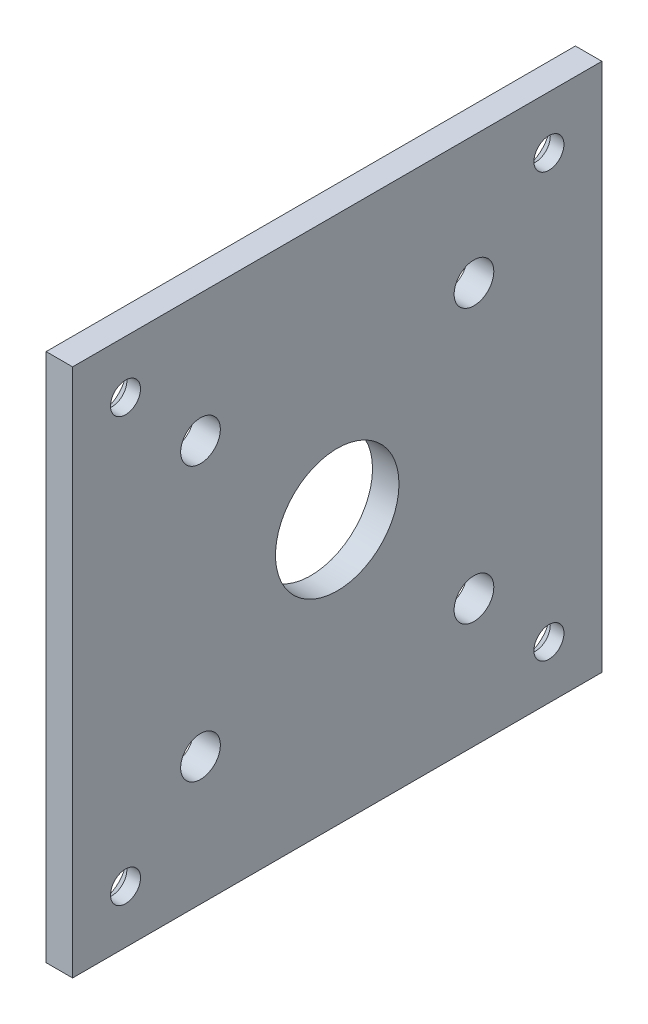
ISO-10303-21;
HEADER;
FILE_DESCRIPTION(('STEP AP214'),'2;1');
FILE_NAME('part.step','',(''),(''),'','','');
FILE_SCHEMA(('AUTOMOTIVE_DESIGN { 1 0 10303 214 1 1 1 1 }'));
ENDSEC;
DATA;
#1=APPLICATION_CONTEXT('core data for automotive mechanical design processes');
#2=APPLICATION_PROTOCOL_DEFINITION('international standard','automotive_design',2000,#1);
#3=PRODUCT_CONTEXT('',#1,'mechanical');
#4=PRODUCT('Part','Part','',(#3));
#5=PRODUCT_RELATED_PRODUCT_CATEGORY('part','',(#4));
#6=PRODUCT_DEFINITION_FORMATION('','',#4);
#7=PRODUCT_DEFINITION_CONTEXT('part definition',#1,'design');
#8=PRODUCT_DEFINITION('design','',#6,#7);
#9=PRODUCT_DEFINITION_SHAPE('','',#8);
#10=(LENGTH_UNIT() NAMED_UNIT(*) SI_UNIT(.MILLI.,.METRE.));
#11=(NAMED_UNIT(*) PLANE_ANGLE_UNIT() SI_UNIT($,.RADIAN.));
#12=(NAMED_UNIT(*) SI_UNIT($,.STERADIAN.) SOLID_ANGLE_UNIT());
#13=UNCERTAINTY_MEASURE_WITH_UNIT(LENGTH_MEASURE(1.E-05),#10,'distance_accuracy_value','');
#14=(GEOMETRIC_REPRESENTATION_CONTEXT(3) GLOBAL_UNCERTAINTY_ASSIGNED_CONTEXT((#13)) GLOBAL_UNIT_ASSIGNED_CONTEXT((#10,
#11,#12)) REPRESENTATION_CONTEXT('',''));
#15=CARTESIAN_POINT('',(0.,0.,0.));
#16=DIRECTION('',(0.,0.,1.));
#17=DIRECTION('',(1.,0.,0.));
#18=AXIS2_PLACEMENT_3D('',#15,#16,#17);
#19=CARTESIAN_POINT('',(0.0193000000194843,6.,6.000049774017));
#20=DIRECTION('',(-1.,0.,0.));
#21=DIRECTION('',(0.,0.,1.));
#22=AXIS2_PLACEMENT_3D('',#19,#20,#21);
#23=CONICAL_SURFACE('',#22,3.15000000003374,0.785398163397448);
#24=CARTESIAN_POINT('',(0.0192999999912898,6.,6.000049774017));
#25=DIRECTION('',(-1.,0.,0.));
#26=DIRECTION('',(0.,0.,1.));
#27=AXIS2_PLACEMENT_3D('',#24,#25,#26);
#28=CIRCLE('',#27,3.15000000006194);
#29=CARTESIAN_POINT('',(0.0192999999912898,6.,9.15004977407894));
#30=VERTEX_POINT('',#29);
#31=EDGE_CURVE('E19',#30,#30,#28,.T.);
#32=ORIENTED_EDGE('',*,*,#31,.T.);
#33=EDGE_LOOP('',(#32));
#34=FACE_BOUND('',#33,.T.);
#35=CARTESIAN_POINT('',(1.4693,6.,6.000049774017));
#36=DIRECTION('',(1.,0.,0.));
#37=DIRECTION('',(0.,0.,-1.));
#38=AXIS2_PLACEMENT_3D('',#35,#36,#37);
#39=CIRCLE('',#38,1.7);
#40=CARTESIAN_POINT('',(1.4693,6.,4.300049774017));
#41=VERTEX_POINT('',#40);
#42=EDGE_CURVE('E125',#41,#41,#39,.T.);
#43=ORIENTED_EDGE('',*,*,#42,.T.);
#44=EDGE_LOOP('',(#43));
#45=FACE_BOUND('',#44,.T.);
#46=ADVANCED_FACE('F16',(#34,#45),#23,.F.);
#47=CARTESIAN_POINT('',(0.0192999999626409,54.,6.000049774017));
#48=DIRECTION('',(-1.,0.,0.));
#49=DIRECTION('',(0.,0.,1.));
#50=AXIS2_PLACEMENT_3D('',#47,#48,#49);
#51=CONICAL_SURFACE('',#50,3.14999999997872,0.785398163397448);
#52=CARTESIAN_POINT('',(0.0192999999362661,54.,6.000049774017));
#53=DIRECTION('',(-1.,0.,0.));
#54=DIRECTION('',(0.,0.,1.));
#55=AXIS2_PLACEMENT_3D('',#52,#53,#54);
#56=CIRCLE('',#55,3.15000000000509);
#57=CARTESIAN_POINT('',(0.0192999999362661,54.,9.15004977402209));
#58=VERTEX_POINT('',#57);
#59=EDGE_CURVE('E130',#58,#58,#56,.T.);
#60=ORIENTED_EDGE('',*,*,#59,.T.);
#61=EDGE_LOOP('',(#60));
#62=FACE_BOUND('',#61,.T.);
#63=CARTESIAN_POINT('',(1.4693,54.,6.000049774017));
#64=DIRECTION('',(1.,0.,0.));
#65=DIRECTION('',(0.,0.,-1.));
#66=AXIS2_PLACEMENT_3D('',#63,#64,#65);
#67=CIRCLE('',#66,1.7);
#68=CARTESIAN_POINT('',(1.4693,54.,4.300049774017));
#69=VERTEX_POINT('',#68);
#70=EDGE_CURVE('E121',#69,#69,#67,.T.);
#71=ORIENTED_EDGE('',*,*,#70,.T.);
#72=EDGE_LOOP('',(#71));
#73=FACE_BOUND('',#72,.T.);
#74=ADVANCED_FACE('F151',(#62,#73),#51,.F.);
#75=CARTESIAN_POINT('',(0.0193000000194843,6.,54.000049774017));
#76=DIRECTION('',(-1.,0.,0.));
#77=DIRECTION('',(0.,0.,1.));
#78=AXIS2_PLACEMENT_3D('',#75,#76,#77);
#79=CONICAL_SURFACE('',#78,3.15000000003374,0.785398163397448);
#80=CARTESIAN_POINT('',(0.0192999999912898,6.,54.000049774017));
#81=DIRECTION('',(-1.,0.,0.));
#82=DIRECTION('',(0.,0.,1.));
#83=AXIS2_PLACEMENT_3D('',#80,#81,#82);
#84=CIRCLE('',#83,3.15000000006194);
#85=CARTESIAN_POINT('',(0.0192999999912898,6.,57.1500497740789));
#86=VERTEX_POINT('',#85);
#87=EDGE_CURVE('E128',#86,#86,#84,.T.);
#88=ORIENTED_EDGE('',*,*,#87,.T.);
#89=EDGE_LOOP('',(#88));
#90=FACE_BOUND('',#89,.T.);
#91=CARTESIAN_POINT('',(1.4693,6.,54.000049774017));
#92=DIRECTION('',(1.,0.,0.));
#93=DIRECTION('',(0.,0.,-1.));
#94=AXIS2_PLACEMENT_3D('',#91,#92,#93);
#95=CIRCLE('',#94,1.7);
#96=CARTESIAN_POINT('',(1.4693,6.,52.300049774017));
#97=VERTEX_POINT('',#96);
#98=EDGE_CURVE('E111',#97,#97,#95,.T.);
#99=ORIENTED_EDGE('',*,*,#98,.T.);
#100=EDGE_LOOP('',(#99));
#101=FACE_BOUND('',#100,.T.);
#102=ADVANCED_FACE('F141',(#90,#101),#79,.F.);
#103=CARTESIAN_POINT('',(0.01929999999999,0.,4.977401658834E-05));
#104=DIRECTION('',(1.,0.,0.));
#105=DIRECTION('',(0.,0.,-1.));
#106=AXIS2_PLACEMENT_3D('',#103,#104,#105);
#107=PLANE('',#106);
#108=CARTESIAN_POINT('',(0.0192999999362661,54.,54.000049774017));
#109=DIRECTION('',(-1.,0.,0.));
#110=DIRECTION('',(0.,0.,1.));
#111=AXIS2_PLACEMENT_3D('',#108,#109,#110);
#112=CIRCLE('',#111,3.15000000000509);
#113=CARTESIAN_POINT('',(0.0192999999362661,54.,57.1500497740221));
#114=VERTEX_POINT('',#113);
#115=EDGE_CURVE('E72',#114,#114,#112,.F.);
#116=ORIENTED_EDGE('',*,*,#115,.T.);
#117=EDGE_LOOP('',(#116));
#118=FACE_BOUND('',#117,.T.);
#119=CARTESIAN_POINT('',(0.01929999999999,45.5,45.500049774017));
#120=DIRECTION('',(1.,0.,0.));
#121=DIRECTION('',(0.,0.,-1.));
#122=AXIS2_PLACEMENT_3D('',#119,#120,#121);
#123=CIRCLE('',#122,2.25);
#124=CARTESIAN_POINT('',(0.01929999999999,45.5,43.250049774017));
#125=VERTEX_POINT('',#124);
#126=EDGE_CURVE('E107',#125,#125,#123,.T.);
#127=ORIENTED_EDGE('',*,*,#126,.T.);
#128=EDGE_LOOP('',(#127));
#129=FACE_BOUND('',#128,.T.);
#130=CARTESIAN_POINT('',(0.01929999999999,30.,30.000049774017));
#131=DIRECTION('',(1.,0.,0.));
#132=DIRECTION('',(0.,0.,-1.));
#133=AXIS2_PLACEMENT_3D('',#130,#131,#132);
#134=CIRCLE('',#133,7.);
#135=CARTESIAN_POINT('',(0.01929999999999,30.,23.000049774017));
#136=VERTEX_POINT('',#135);
#137=EDGE_CURVE('E115',#136,#136,#134,.T.);
#138=ORIENTED_EDGE('',*,*,#137,.T.);
#139=EDGE_LOOP('',(#138));
#140=FACE_BOUND('',#139,.T.);
#141=ORIENTED_EDGE('',*,*,#87,.F.);
#142=EDGE_LOOP('',(#141));
#143=FACE_BOUND('',#142,.T.);
#144=CARTESIAN_POINT('',(0.01929999999999,14.5,45.500049774017));
#145=DIRECTION('',(1.,0.,0.));
#146=DIRECTION('',(0.,0.,-1.));
#147=AXIS2_PLACEMENT_3D('',#144,#145,#146);
#148=CIRCLE('',#147,2.25);
#149=CARTESIAN_POINT('',(0.01929999999999,14.5,43.250049774017));
#150=VERTEX_POINT('',#149);
#151=EDGE_CURVE('E112',#150,#150,#148,.T.);
#152=ORIENTED_EDGE('',*,*,#151,.T.);
#153=EDGE_LOOP('',(#152));
#154=FACE_BOUND('',#153,.T.);
#155=CARTESIAN_POINT('',(0.01929999999999,45.5,14.500049774017));
#156=DIRECTION('',(1.,0.,0.));
#157=DIRECTION('',(0.,0.,-1.));
#158=AXIS2_PLACEMENT_3D('',#155,#156,#157);
#159=CIRCLE('',#158,2.25);
#160=CARTESIAN_POINT('',(0.01929999999999,45.5,12.250049774017));
#161=VERTEX_POINT('',#160);
#162=EDGE_CURVE('E118',#161,#161,#159,.T.);
#163=ORIENTED_EDGE('',*,*,#162,.T.);
#164=EDGE_LOOP('',(#163));
#165=FACE_BOUND('',#164,.T.);
#166=ORIENTED_EDGE('',*,*,#59,.F.);
#167=EDGE_LOOP('',(#166));
#168=FACE_BOUND('',#167,.T.);
#169=CARTESIAN_POINT('',(0.01929999999999,14.5,14.500049774017));
#170=DIRECTION('',(1.,0.,0.));
#171=DIRECTION('',(0.,0.,-1.));
#172=AXIS2_PLACEMENT_3D('',#169,#170,#171);
#173=CIRCLE('',#172,2.25);
#174=CARTESIAN_POINT('',(0.01929999999999,14.5,12.250049774017));
#175=VERTEX_POINT('',#174);
#176=EDGE_CURVE('E122',#175,#175,#173,.T.);
#177=ORIENTED_EDGE('',*,*,#176,.T.);
#178=EDGE_LOOP('',(#177));
#179=FACE_BOUND('',#178,.T.);
#180=ORIENTED_EDGE('',*,*,#31,.F.);
#181=EDGE_LOOP('',(#180));
#182=FACE_BOUND('',#181,.T.);
#183=DIRECTION('',(0.,0.,1.));
#184=VECTOR('',#183,1.);
#185=CARTESIAN_POINT('',(0.01929999999999,60.,4.977401658834E-05));
#186=LINE('',#185,#184);
#187=CARTESIAN_POINT('',(0.01929999999999,60.,4.977401658834E-05));
#188=VERTEX_POINT('',#187);
#189=CARTESIAN_POINT('',(0.01929999999999,60.,60.000049774017));
#190=VERTEX_POINT('',#189);
#191=EDGE_CURVE('E62',#188,#190,#186,.T.);
#192=ORIENTED_EDGE('',*,*,#191,.F.);
#193=DIRECTION('',(0.,1.,0.));
#194=VECTOR('',#193,1.);
#195=CARTESIAN_POINT('',(0.01929999999999,0.,4.977401658834E-05));
#196=LINE('',#195,#194);
#197=CARTESIAN_POINT('',(0.01929999999999,0.,4.977401658834E-05));
#198=VERTEX_POINT('',#197);
#199=EDGE_CURVE('E55',#188,#198,#196,.F.);
#200=ORIENTED_EDGE('',*,*,#199,.T.);
#201=DIRECTION('',(0.,0.,1.));
#202=VECTOR('',#201,1.);
#203=CARTESIAN_POINT('',(0.01929999999999,0.,4.977401658834E-05));
#204=LINE('',#203,#202);
#205=CARTESIAN_POINT('',(0.01929999999999,0.,60.000049774017));
#206=VERTEX_POINT('',#205);
#207=EDGE_CURVE('E60',#198,#206,#204,.T.);
#208=ORIENTED_EDGE('',*,*,#207,.T.);
#209=DIRECTION('',(0.,1.,0.));
#210=VECTOR('',#209,1.);
#211=CARTESIAN_POINT('',(0.01929999999999,0.,60.000049774017));
#212=LINE('',#211,#210);
#213=EDGE_CURVE('E340',#190,#206,#212,.F.);
#214=ORIENTED_EDGE('',*,*,#213,.F.);
#215=EDGE_LOOP('',(#192,#200,#208,#214));
#216=FACE_BOUND('',#215,.T.);
#217=ADVANCED_FACE('F59',(#118,#129,#140,#143,#154,#165,#168,#179,#182,#216),#107,.F.);
#218=CARTESIAN_POINT('',(0.0192999999626409,54.,54.000049774017));
#219=DIRECTION('',(-1.,0.,0.));
#220=DIRECTION('',(0.,0.,1.));
#221=AXIS2_PLACEMENT_3D('',#218,#219,#220);
#222=CONICAL_SURFACE('',#221,3.14999999997872,0.785398163397448);
#223=ORIENTED_EDGE('',*,*,#115,.F.);
#224=EDGE_LOOP('',(#223));
#225=FACE_BOUND('',#224,.T.);
#226=CARTESIAN_POINT('',(1.4693,54.,54.000049774017));
#227=DIRECTION('',(1.,0.,0.));
#228=DIRECTION('',(0.,0.,-1.));
#229=AXIS2_PLACEMENT_3D('',#226,#227,#228);
#230=CIRCLE('',#229,1.7);
#231=CARTESIAN_POINT('',(1.4693,54.,52.300049774017));
#232=VERTEX_POINT('',#231);
#233=EDGE_CURVE('E110',#232,#232,#230,.T.);
#234=ORIENTED_EDGE('',*,*,#233,.T.);
#235=EDGE_LOOP('',(#234));
#236=FACE_BOUND('',#235,.T.);
#237=ADVANCED_FACE('F140',(#225,#236),#222,.F.);
#238=CARTESIAN_POINT('',(0.01929999999999,0.,4.977401658834E-05));
#239=DIRECTION('',(0.,1.,0.));
#240=DIRECTION('',(0.,0.,1.));
#241=AXIS2_PLACEMENT_3D('',#238,#239,#240);
#242=PLANE('',#241);
#243=DIRECTION('',(1.,0.,0.));
#244=VECTOR('',#243,1.);
#245=CARTESIAN_POINT('',(0.01929999999999,0.,60.000049774017));
#246=LINE('',#245,#244);
#247=CARTESIAN_POINT('',(3.0193,0.,60.000049774017));
#248=VERTEX_POINT('',#247);
#249=EDGE_CURVE('E70',#206,#248,#246,.T.);
#250=ORIENTED_EDGE('',*,*,#249,.F.);
#251=ORIENTED_EDGE('',*,*,#207,.F.);
#252=DIRECTION('',(1.,0.,0.));
#253=VECTOR('',#252,1.);
#254=CARTESIAN_POINT('',(0.01929999999999,0.,4.977401658834E-05));
#255=LINE('',#254,#253);
#256=CARTESIAN_POINT('',(3.0193,0.,4.977401658834E-05));
#257=VERTEX_POINT('',#256);
#258=EDGE_CURVE('E64',#198,#257,#255,.T.);
#259=ORIENTED_EDGE('',*,*,#258,.T.);
#260=DIRECTION('',(0.,0.,-1.));
#261=VECTOR('',#260,1.);
#262=CARTESIAN_POINT('',(3.0193,0.,4.977401658834E-05));
#263=LINE('',#262,#261);
#264=EDGE_CURVE('E347',#248,#257,#263,.T.);
#265=ORIENTED_EDGE('',*,*,#264,.F.);
#266=EDGE_LOOP('',(#250,#251,#259,#265));
#267=FACE_BOUND('',#266,.T.);
#268=ADVANCED_FACE('F67',(#267),#242,.F.);
#269=CARTESIAN_POINT('',(0.01929999999999,0.,4.977401658834E-05));
#270=DIRECTION('',(0.,0.,1.));
#271=DIRECTION('',(1.,0.,0.));
#272=AXIS2_PLACEMENT_3D('',#269,#270,#271);
#273=PLANE('',#272);
#274=DIRECTION('',(0.,1.,0.));
#275=VECTOR('',#274,1.);
#276=CARTESIAN_POINT('',(3.0193,0.,4.977401658834E-05));
#277=LINE('',#276,#275);
#278=CARTESIAN_POINT('',(3.0193,60.,4.977401658834E-05));
#279=VERTEX_POINT('',#278);
#280=EDGE_CURVE('E76',#257,#279,#277,.T.);
#281=ORIENTED_EDGE('',*,*,#280,.F.);
#282=ORIENTED_EDGE('',*,*,#258,.F.);
#283=ORIENTED_EDGE('',*,*,#199,.F.);
#284=DIRECTION('',(1.,0.,0.));
#285=VECTOR('',#284,1.);
#286=CARTESIAN_POINT('',(0.01929999999999,60.,4.977401658834E-05));
#287=LINE('',#286,#285);
#288=EDGE_CURVE('E78',#279,#188,#287,.F.);
#289=ORIENTED_EDGE('',*,*,#288,.F.);
#290=EDGE_LOOP('',(#281,#282,#283,#289));
#291=FACE_BOUND('',#290,.T.);
#292=ADVANCED_FACE('F74',(#291),#273,.F.);
#293=CARTESIAN_POINT('',(0.01929999999999,60.,4.977401658834E-05));
#294=DIRECTION('',(0.,1.,0.));
#295=DIRECTION('',(0.,0.,1.));
#296=AXIS2_PLACEMENT_3D('',#293,#294,#295);
#297=PLANE('',#296);
#298=DIRECTION('',(1.,0.,0.));
#299=VECTOR('',#298,1.);
#300=CARTESIAN_POINT('',(0.01929999999999,60.,60.000049774017));
#301=LINE('',#300,#299);
#302=CARTESIAN_POINT('',(3.0193,60.,60.000049774017));
#303=VERTEX_POINT('',#302);
#304=EDGE_CURVE('E34',#303,#190,#301,.F.);
#305=ORIENTED_EDGE('',*,*,#304,.F.);
#306=DIRECTION('',(0.,0.,-1.));
#307=VECTOR('',#306,1.);
#308=CARTESIAN_POINT('',(3.0193,60.,4.977401658834E-05));
#309=LINE('',#308,#307);
#310=EDGE_CURVE('E344',#279,#303,#309,.F.);
#311=ORIENTED_EDGE('',*,*,#310,.F.);
#312=ORIENTED_EDGE('',*,*,#288,.T.);
#313=ORIENTED_EDGE('',*,*,#191,.T.);
#314=EDGE_LOOP('',(#305,#311,#312,#313));
#315=FACE_BOUND('',#314,.T.);
#316=ADVANCED_FACE('F202',(#315),#297,.T.);
#317=CARTESIAN_POINT('',(0.01929999999999,0.,60.000049774017));
#318=DIRECTION('',(0.,0.,1.));
#319=DIRECTION('',(1.,0.,0.));
#320=AXIS2_PLACEMENT_3D('',#317,#318,#319);
#321=PLANE('',#320);
#322=DIRECTION('',(0.,1.,0.));
#323=VECTOR('',#322,1.);
#324=CARTESIAN_POINT('',(3.0193,0.,60.000049774017));
#325=LINE('',#324,#323);
#326=EDGE_CURVE('E106',#303,#248,#325,.F.);
#327=ORIENTED_EDGE('',*,*,#326,.F.);
#328=ORIENTED_EDGE('',*,*,#304,.T.);
#329=ORIENTED_EDGE('',*,*,#213,.T.);
#330=ORIENTED_EDGE('',*,*,#249,.T.);
#331=EDGE_LOOP('',(#327,#328,#329,#330));
#332=FACE_BOUND('',#331,.T.);
#333=ADVANCED_FACE('F198',(#332),#321,.T.);
#334=CARTESIAN_POINT('',(0.01929999999999,6.,6.000049774017));
#335=DIRECTION('',(1.,0.,0.));
#336=DIRECTION('',(0.,0.,-1.));
#337=AXIS2_PLACEMENT_3D('',#334,#335,#336);
#338=CYLINDRICAL_SURFACE('',#337,1.7);
#339=CARTESIAN_POINT('',(3.0193,6.,6.000049774017));
#340=DIRECTION('',(1.,0.,0.));
#341=DIRECTION('',(0.,0.,-1.));
#342=AXIS2_PLACEMENT_3D('',#339,#340,#341);
#343=CIRCLE('',#342,1.7);
#344=CARTESIAN_POINT('',(3.0193,6.,4.300049774017));
#345=VERTEX_POINT('',#344);
#346=EDGE_CURVE('E103',#345,#345,#343,.F.);
#347=ORIENTED_EDGE('',*,*,#346,.F.);
#348=EDGE_LOOP('',(#347));
#349=FACE_BOUND('',#348,.T.);
#350=ORIENTED_EDGE('',*,*,#42,.F.);
#351=EDGE_LOOP('',(#350));
#352=FACE_BOUND('',#351,.T.);
#353=ADVANCED_FACE('F194',(#349,#352),#338,.F.);
#354=CARTESIAN_POINT('',(0.01929999999999,14.5,14.500049774017));
#355=DIRECTION('',(1.,0.,0.));
#356=DIRECTION('',(0.,0.,-1.));
#357=AXIS2_PLACEMENT_3D('',#354,#355,#356);
#358=CYLINDRICAL_SURFACE('',#357,2.25);
#359=ORIENTED_EDGE('',*,*,#176,.F.);
#360=EDGE_LOOP('',(#359));
#361=FACE_BOUND('',#360,.T.);
#362=CARTESIAN_POINT('',(3.0193,14.5,14.500049774017));
#363=DIRECTION('',(1.,0.,0.));
#364=DIRECTION('',(0.,0.,-1.));
#365=AXIS2_PLACEMENT_3D('',#362,#363,#364);
#366=CIRCLE('',#365,2.25);
#367=CARTESIAN_POINT('',(3.0193,14.5,12.250049774017));
#368=VERTEX_POINT('',#367);
#369=EDGE_CURVE('E100',#368,#368,#366,.F.);
#370=ORIENTED_EDGE('',*,*,#369,.F.);
#371=EDGE_LOOP('',(#370));
#372=FACE_BOUND('',#371,.T.);
#373=ADVANCED_FACE('F190',(#361,#372),#358,.F.);
#374=CARTESIAN_POINT('',(0.01929999999999,54.,6.000049774017));
#375=DIRECTION('',(1.,0.,0.));
#376=DIRECTION('',(0.,0.,-1.));
#377=AXIS2_PLACEMENT_3D('',#374,#375,#376);
#378=CYLINDRICAL_SURFACE('',#377,1.7);
#379=CARTESIAN_POINT('',(3.0193,54.,6.000049774017));
#380=DIRECTION('',(1.,0.,0.));
#381=DIRECTION('',(0.,0.,-1.));
#382=AXIS2_PLACEMENT_3D('',#379,#380,#381);
#383=CIRCLE('',#382,1.7);
#384=CARTESIAN_POINT('',(3.0193,54.,4.300049774017));
#385=VERTEX_POINT('',#384);
#386=EDGE_CURVE('E97',#385,#385,#383,.F.);
#387=ORIENTED_EDGE('',*,*,#386,.F.);
#388=EDGE_LOOP('',(#387));
#389=FACE_BOUND('',#388,.T.);
#390=ORIENTED_EDGE('',*,*,#70,.F.);
#391=EDGE_LOOP('',(#390));
#392=FACE_BOUND('',#391,.T.);
#393=ADVANCED_FACE('F186',(#389,#392),#378,.F.);
#394=CARTESIAN_POINT('',(0.01929999999999,45.5,14.500049774017));
#395=DIRECTION('',(1.,0.,0.));
#396=DIRECTION('',(0.,0.,-1.));
#397=AXIS2_PLACEMENT_3D('',#394,#395,#396);
#398=CYLINDRICAL_SURFACE('',#397,2.25);
#399=ORIENTED_EDGE('',*,*,#162,.F.);
#400=EDGE_LOOP('',(#399));
#401=FACE_BOUND('',#400,.T.);
#402=CARTESIAN_POINT('',(3.0193,45.5,14.500049774017));
#403=DIRECTION('',(1.,0.,0.));
#404=DIRECTION('',(0.,0.,-1.));
#405=AXIS2_PLACEMENT_3D('',#402,#403,#404);
#406=CIRCLE('',#405,2.25);
#407=CARTESIAN_POINT('',(3.0193,45.5,12.250049774017));
#408=VERTEX_POINT('',#407);
#409=EDGE_CURVE('E94',#408,#408,#406,.F.);
#410=ORIENTED_EDGE('',*,*,#409,.F.);
#411=EDGE_LOOP('',(#410));
#412=FACE_BOUND('',#411,.T.);
#413=ADVANCED_FACE('F182',(#401,#412),#398,.F.);
#414=CARTESIAN_POINT('',(0.01929999999999,30.,30.000049774017));
#415=DIRECTION('',(1.,0.,0.));
#416=DIRECTION('',(0.,0.,-1.));
#417=AXIS2_PLACEMENT_3D('',#414,#415,#416);
#418=CYLINDRICAL_SURFACE('',#417,7.);
#419=ORIENTED_EDGE('',*,*,#137,.F.);
#420=EDGE_LOOP('',(#419));
#421=FACE_BOUND('',#420,.T.);
#422=CARTESIAN_POINT('',(3.0193,30.,30.000049774017));
#423=DIRECTION('',(1.,0.,0.));
#424=DIRECTION('',(0.,0.,-1.));
#425=AXIS2_PLACEMENT_3D('',#422,#423,#424);
#426=CIRCLE('',#425,7.);
#427=CARTESIAN_POINT('',(3.0193,30.,23.000049774017));
#428=VERTEX_POINT('',#427);
#429=EDGE_CURVE('E91',#428,#428,#426,.F.);
#430=ORIENTED_EDGE('',*,*,#429,.F.);
#431=EDGE_LOOP('',(#430));
#432=FACE_BOUND('',#431,.T.);
#433=ADVANCED_FACE('F178',(#421,#432),#418,.F.);
#434=CARTESIAN_POINT('',(0.01929999999999,14.5,45.500049774017));
#435=DIRECTION('',(1.,0.,0.));
#436=DIRECTION('',(0.,0.,-1.));
#437=AXIS2_PLACEMENT_3D('',#434,#435,#436);
#438=CYLINDRICAL_SURFACE('',#437,2.25);
#439=ORIENTED_EDGE('',*,*,#151,.F.);
#440=EDGE_LOOP('',(#439));
#441=FACE_BOUND('',#440,.T.);
#442=CARTESIAN_POINT('',(3.0193,14.5,45.500049774017));
#443=DIRECTION('',(1.,0.,0.));
#444=DIRECTION('',(0.,0.,-1.));
#445=AXIS2_PLACEMENT_3D('',#442,#443,#444);
#446=CIRCLE('',#445,2.25);
#447=CARTESIAN_POINT('',(3.0193,14.5,43.250049774017));
#448=VERTEX_POINT('',#447);
#449=EDGE_CURVE('E88',#448,#448,#446,.F.);
#450=ORIENTED_EDGE('',*,*,#449,.F.);
#451=EDGE_LOOP('',(#450));
#452=FACE_BOUND('',#451,.T.);
#453=ADVANCED_FACE('F174',(#441,#452),#438,.F.);
#454=CARTESIAN_POINT('',(0.01929999999999,6.,54.000049774017));
#455=DIRECTION('',(1.,0.,0.));
#456=DIRECTION('',(0.,0.,-1.));
#457=AXIS2_PLACEMENT_3D('',#454,#455,#456);
#458=CYLINDRICAL_SURFACE('',#457,1.7);
#459=CARTESIAN_POINT('',(3.0193,6.,54.000049774017));
#460=DIRECTION('',(1.,0.,0.));
#461=DIRECTION('',(0.,0.,-1.));
#462=AXIS2_PLACEMENT_3D('',#459,#460,#461);
#463=CIRCLE('',#462,1.7);
#464=CARTESIAN_POINT('',(3.0193,6.,52.300049774017));
#465=VERTEX_POINT('',#464);
#466=EDGE_CURVE('E85',#465,#465,#463,.F.);
#467=ORIENTED_EDGE('',*,*,#466,.F.);
#468=EDGE_LOOP('',(#467));
#469=FACE_BOUND('',#468,.T.);
#470=ORIENTED_EDGE('',*,*,#98,.F.);
#471=EDGE_LOOP('',(#470));
#472=FACE_BOUND('',#471,.T.);
#473=ADVANCED_FACE('F170',(#469,#472),#458,.F.);
#474=CARTESIAN_POINT('',(0.01929999999999,45.5,45.500049774017));
#475=DIRECTION('',(1.,0.,0.));
#476=DIRECTION('',(0.,0.,-1.));
#477=AXIS2_PLACEMENT_3D('',#474,#475,#476);
#478=CYLINDRICAL_SURFACE('',#477,2.25);
#479=ORIENTED_EDGE('',*,*,#126,.F.);
#480=EDGE_LOOP('',(#479));
#481=FACE_BOUND('',#480,.T.);
#482=CARTESIAN_POINT('',(3.0193,45.5,45.500049774017));
#483=DIRECTION('',(1.,0.,0.));
#484=DIRECTION('',(0.,0.,-1.));
#485=AXIS2_PLACEMENT_3D('',#482,#483,#484);
#486=CIRCLE('',#485,2.25);
#487=CARTESIAN_POINT('',(3.0193,45.5,43.250049774017));
#488=VERTEX_POINT('',#487);
#489=EDGE_CURVE('E25',#488,#488,#486,.F.);
#490=ORIENTED_EDGE('',*,*,#489,.F.);
#491=EDGE_LOOP('',(#490));
#492=FACE_BOUND('',#491,.T.);
#493=ADVANCED_FACE('F163',(#481,#492),#478,.F.);
#494=CARTESIAN_POINT('',(0.01929999999999,54.,54.000049774017));
#495=DIRECTION('',(1.,0.,0.));
#496=DIRECTION('',(0.,0.,-1.));
#497=AXIS2_PLACEMENT_3D('',#494,#495,#496);
#498=CYLINDRICAL_SURFACE('',#497,1.7);
#499=CARTESIAN_POINT('',(3.0193,54.,54.000049774017));
#500=DIRECTION('',(1.,0.,0.));
#501=DIRECTION('',(0.,0.,-1.));
#502=AXIS2_PLACEMENT_3D('',#499,#500,#501);
#503=CIRCLE('',#502,1.7);
#504=CARTESIAN_POINT('',(3.0193,54.,52.300049774017));
#505=VERTEX_POINT('',#504);
#506=EDGE_CURVE('E11',#505,#505,#503,.F.);
#507=ORIENTED_EDGE('',*,*,#506,.F.);
#508=EDGE_LOOP('',(#507));
#509=FACE_BOUND('',#508,.T.);
#510=ORIENTED_EDGE('',*,*,#233,.F.);
#511=EDGE_LOOP('',(#510));
#512=FACE_BOUND('',#511,.T.);
#513=ADVANCED_FACE('F157',(#509,#512),#498,.F.);
#514=CARTESIAN_POINT('',(3.0193,0.,4.977401658834E-05));
#515=DIRECTION('',(1.,0.,0.));
#516=DIRECTION('',(0.,0.,-1.));
#517=AXIS2_PLACEMENT_3D('',#514,#515,#516);
#518=PLANE('',#517);
#519=ORIENTED_EDGE('',*,*,#506,.T.);
#520=EDGE_LOOP('',(#519));
#521=FACE_BOUND('',#520,.T.);
#522=ORIENTED_EDGE('',*,*,#489,.T.);
#523=EDGE_LOOP('',(#522));
#524=FACE_BOUND('',#523,.T.);
#525=ORIENTED_EDGE('',*,*,#466,.T.);
#526=EDGE_LOOP('',(#525));
#527=FACE_BOUND('',#526,.T.);
#528=ORIENTED_EDGE('',*,*,#449,.T.);
#529=EDGE_LOOP('',(#528));
#530=FACE_BOUND('',#529,.T.);
#531=ORIENTED_EDGE('',*,*,#429,.T.);
#532=EDGE_LOOP('',(#531));
#533=FACE_BOUND('',#532,.T.);
#534=ORIENTED_EDGE('',*,*,#409,.T.);
#535=EDGE_LOOP('',(#534));
#536=FACE_BOUND('',#535,.T.);
#537=ORIENTED_EDGE('',*,*,#386,.T.);
#538=EDGE_LOOP('',(#537));
#539=FACE_BOUND('',#538,.T.);
#540=ORIENTED_EDGE('',*,*,#369,.T.);
#541=EDGE_LOOP('',(#540));
#542=FACE_BOUND('',#541,.T.);
#543=ORIENTED_EDGE('',*,*,#346,.T.);
#544=EDGE_LOOP('',(#543));
#545=FACE_BOUND('',#544,.T.);
#546=ORIENTED_EDGE('',*,*,#310,.T.);
#547=ORIENTED_EDGE('',*,*,#326,.T.);
#548=ORIENTED_EDGE('',*,*,#264,.T.);
#549=ORIENTED_EDGE('',*,*,#280,.T.);
#550=EDGE_LOOP('',(#546,#547,#548,#549));
#551=FACE_BOUND('',#550,.T.);
#552=ADVANCED_FACE('F155',(#521,#524,#527,#530,#533,#536,#539,#542,#545,#551),#518,.T.);
#553=CLOSED_SHELL('',(#46,#74,#102,#217,#237,#268,#292,#316,#333,#353,#373,#393,#413,#433,#453,
#473,#493,#513,#552));
#554=MANIFOLD_SOLID_BREP('B1',#553);
#555=ADVANCED_BREP_SHAPE_REPRESENTATION('',(#18,#554),#14);
#556=SHAPE_DEFINITION_REPRESENTATION(#9,#555);
ENDSEC;
END-ISO-10303-21;
